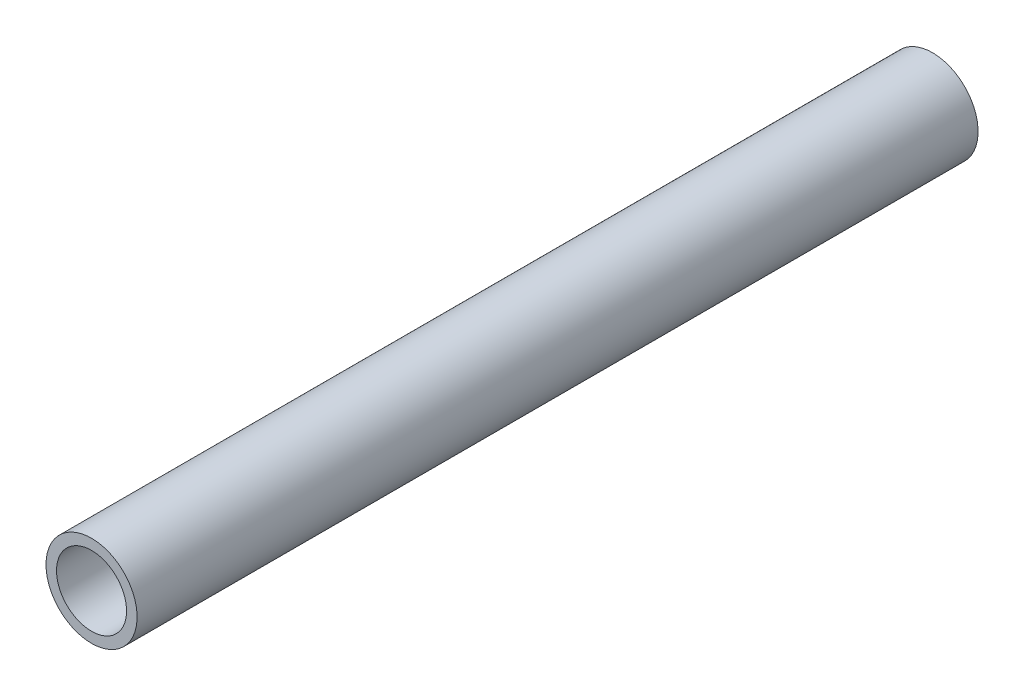
ISO-10303-21;
HEADER;
FILE_DESCRIPTION(('STEP AP214'),'2;1');
FILE_NAME('part.step','',(''),(''),'','','');
FILE_SCHEMA(('AUTOMOTIVE_DESIGN { 1 0 10303 214 1 1 1 1 }'));
ENDSEC;
DATA;
#1=APPLICATION_CONTEXT('core data for automotive mechanical design processes');
#2=APPLICATION_PROTOCOL_DEFINITION('international standard','automotive_design',2000,#1);
#3=PRODUCT_CONTEXT('',#1,'mechanical');
#4=PRODUCT('Part','Part','',(#3));
#5=PRODUCT_RELATED_PRODUCT_CATEGORY('part','',(#4));
#6=PRODUCT_DEFINITION_FORMATION('','',#4);
#7=PRODUCT_DEFINITION_CONTEXT('part definition',#1,'design');
#8=PRODUCT_DEFINITION('design','',#6,#7);
#9=PRODUCT_DEFINITION_SHAPE('','',#8);
#10=(LENGTH_UNIT() NAMED_UNIT(*) SI_UNIT(.MILLI.,.METRE.));
#11=(NAMED_UNIT(*) PLANE_ANGLE_UNIT() SI_UNIT($,.RADIAN.));
#12=(NAMED_UNIT(*) SI_UNIT($,.STERADIAN.) SOLID_ANGLE_UNIT());
#13=UNCERTAINTY_MEASURE_WITH_UNIT(LENGTH_MEASURE(1.E-05),#10,'distance_accuracy_value','');
#14=(GEOMETRIC_REPRESENTATION_CONTEXT(3) GLOBAL_UNCERTAINTY_ASSIGNED_CONTEXT((#13)) GLOBAL_UNIT_ASSIGNED_CONTEXT((#10,
#11,#12)) REPRESENTATION_CONTEXT('',''));
#15=CARTESIAN_POINT('',(0.,0.,0.));
#16=DIRECTION('',(0.,0.,1.));
#17=DIRECTION('',(1.,0.,0.));
#18=AXIS2_PLACEMENT_3D('',#15,#16,#17);
#19=CARTESIAN_POINT('',(0.,0.,304.8));
#20=DIRECTION('',(0.,0.,1.));
#21=DIRECTION('',(1.,0.,0.));
#22=AXIS2_PLACEMENT_3D('',#19,#20,#21);
#23=PLANE('',#22);
#24=CARTESIAN_POINT('',(0.,0.,304.8));
#25=DIRECTION('',(0.,0.,1.));
#26=DIRECTION('',(1.,0.,0.));
#27=AXIS2_PLACEMENT_3D('',#24,#25,#26);
#28=CIRCLE('',#27,16.51);
#29=CARTESIAN_POINT('',(-16.51,0.,304.8));
#30=VERTEX_POINT('',#29);
#31=EDGE_CURVE('E10',#30,#30,#28,.T.);
#32=ORIENTED_EDGE('',*,*,#31,.T.);
#33=EDGE_LOOP('',(#32));
#34=FACE_BOUND('',#33,.T.);
#35=CARTESIAN_POINT('',(0.,0.,304.8));
#36=DIRECTION('',(0.,0.,1.));
#37=DIRECTION('',(1.,0.,0.));
#38=AXIS2_PLACEMENT_3D('',#35,#36,#37);
#39=CIRCLE('',#38,12.7);
#40=CARTESIAN_POINT('',(-12.7,0.,304.8));
#41=VERTEX_POINT('',#40);
#42=EDGE_CURVE('E45',#41,#41,#39,.T.);
#43=ORIENTED_EDGE('',*,*,#42,.F.);
#44=EDGE_LOOP('',(#43));
#45=FACE_BOUND('',#44,.T.);
#46=ADVANCED_FACE('F34',(#34,#45),#23,.T.);
#47=CARTESIAN_POINT('',(0.,0.,0.));
#48=DIRECTION('',(0.,0.,1.));
#49=DIRECTION('',(1.,0.,0.));
#50=AXIS2_PLACEMENT_3D('',#47,#48,#49);
#51=PLANE('',#50);
#52=CARTESIAN_POINT('',(0.,0.,0.));
#53=DIRECTION('',(0.,0.,1.));
#54=DIRECTION('',(1.,0.,0.));
#55=AXIS2_PLACEMENT_3D('',#52,#53,#54);
#56=CIRCLE('',#55,16.51);
#57=CARTESIAN_POINT('',(-16.51,0.,0.));
#58=VERTEX_POINT('',#57);
#59=EDGE_CURVE('E38',#58,#58,#56,.T.);
#60=ORIENTED_EDGE('',*,*,#59,.F.);
#61=EDGE_LOOP('',(#60));
#62=FACE_BOUND('',#61,.T.);
#63=CARTESIAN_POINT('',(0.,0.,0.));
#64=DIRECTION('',(0.,0.,1.));
#65=DIRECTION('',(1.,0.,0.));
#66=AXIS2_PLACEMENT_3D('',#63,#64,#65);
#67=CIRCLE('',#66,12.7);
#68=CARTESIAN_POINT('',(-12.7,0.,0.));
#69=VERTEX_POINT('',#68);
#70=EDGE_CURVE('E47',#69,#69,#67,.T.);
#71=ORIENTED_EDGE('',*,*,#70,.T.);
#72=EDGE_LOOP('',(#71));
#73=FACE_BOUND('',#72,.T.);
#74=ADVANCED_FACE('F57',(#62,#73),#51,.F.);
#75=CARTESIAN_POINT('',(0.,0.,304.8));
#76=DIRECTION('',(0.,0.,-1.));
#77=DIRECTION('',(-1.,0.,0.));
#78=AXIS2_PLACEMENT_3D('',#75,#76,#77);
#79=CYLINDRICAL_SURFACE('',#78,16.51);
#80=CARTESIAN_POINT('',(-16.51,0.,304.8));
#81=CARTESIAN_POINT('',(-16.51,0.,301.625));
#82=CARTESIAN_POINT('',(-16.51,0.,298.45));
#83=CARTESIAN_POINT('',(-16.51,0.,292.1));
#84=CARTESIAN_POINT('',(-16.51,0.,288.925));
#85=CARTESIAN_POINT('',(-16.51,0.,282.575));
#86=CARTESIAN_POINT('',(-16.51,0.,279.4));
#87=CARTESIAN_POINT('',(-16.51,0.,273.05));
#88=CARTESIAN_POINT('',(-16.51,0.,269.875));
#89=CARTESIAN_POINT('',(-16.51,0.,263.525));
#90=CARTESIAN_POINT('',(-16.51,0.,260.35));
#91=CARTESIAN_POINT('',(-16.51,0.,254.));
#92=CARTESIAN_POINT('',(-16.51,0.,250.825));
#93=CARTESIAN_POINT('',(-16.51,0.,244.475));
#94=CARTESIAN_POINT('',(-16.51,0.,241.3));
#95=CARTESIAN_POINT('',(-16.51,0.,234.95));
#96=CARTESIAN_POINT('',(-16.51,0.,231.775));
#97=CARTESIAN_POINT('',(-16.51,0.,225.425));
#98=CARTESIAN_POINT('',(-16.51,0.,222.25));
#99=CARTESIAN_POINT('',(-16.51,0.,215.9));
#100=CARTESIAN_POINT('',(-16.51,0.,212.725));
#101=CARTESIAN_POINT('',(-16.51,0.,206.375));
#102=CARTESIAN_POINT('',(-16.51,0.,203.2));
#103=CARTESIAN_POINT('',(-16.51,0.,196.85));
#104=CARTESIAN_POINT('',(-16.51,0.,193.675));
#105=CARTESIAN_POINT('',(-16.51,0.,187.325));
#106=CARTESIAN_POINT('',(-16.51,0.,184.15));
#107=CARTESIAN_POINT('',(-16.51,0.,177.8));
#108=CARTESIAN_POINT('',(-16.51,0.,174.625));
#109=CARTESIAN_POINT('',(-16.51,0.,168.275));
#110=CARTESIAN_POINT('',(-16.51,0.,165.1));
#111=CARTESIAN_POINT('',(-16.51,0.,158.75));
#112=CARTESIAN_POINT('',(-16.51,0.,155.575));
#113=CARTESIAN_POINT('',(-16.51,0.,149.225));
#114=CARTESIAN_POINT('',(-16.51,0.,146.05));
#115=CARTESIAN_POINT('',(-16.51,0.,139.7));
#116=CARTESIAN_POINT('',(-16.51,0.,136.525));
#117=CARTESIAN_POINT('',(-16.51,0.,130.175));
#118=CARTESIAN_POINT('',(-16.51,0.,127.));
#119=CARTESIAN_POINT('',(-16.51,0.,120.65));
#120=CARTESIAN_POINT('',(-16.51,0.,117.475));
#121=CARTESIAN_POINT('',(-16.51,0.,111.125));
#122=CARTESIAN_POINT('',(-16.51,0.,107.95));
#123=CARTESIAN_POINT('',(-16.51,0.,101.6));
#124=CARTESIAN_POINT('',(-16.51,0.,98.425));
#125=CARTESIAN_POINT('',(-16.51,0.,92.075));
#126=CARTESIAN_POINT('',(-16.51,0.,88.9));
#127=CARTESIAN_POINT('',(-16.51,0.,82.55));
#128=CARTESIAN_POINT('',(-16.51,0.,79.375));
#129=CARTESIAN_POINT('',(-16.51,0.,73.025));
#130=CARTESIAN_POINT('',(-16.51,0.,69.85));
#131=CARTESIAN_POINT('',(-16.51,0.,63.5));
#132=CARTESIAN_POINT('',(-16.51,0.,60.325));
#133=CARTESIAN_POINT('',(-16.51,0.,53.975));
#134=CARTESIAN_POINT('',(-16.51,0.,50.8));
#135=CARTESIAN_POINT('',(-16.51,0.,44.45));
#136=CARTESIAN_POINT('',(-16.51,0.,41.275));
#137=CARTESIAN_POINT('',(-16.51,0.,34.925));
#138=CARTESIAN_POINT('',(-16.51,0.,31.75));
#139=CARTESIAN_POINT('',(-16.51,0.,25.4));
#140=CARTESIAN_POINT('',(-16.51,0.,22.225));
#141=CARTESIAN_POINT('',(-16.51,0.,15.875));
#142=CARTESIAN_POINT('',(-16.51,0.,12.7));
#143=CARTESIAN_POINT('',(-16.51,0.,6.35));
#144=CARTESIAN_POINT('',(-16.51,0.,3.175));
#145=CARTESIAN_POINT('',(-16.51,0.,0.));
#146=B_SPLINE_CURVE_WITH_KNOTS('',3,(#80,#81,#82,#83,#84,#85,#86,#87,#88,#89,#90,#91,#92,#93,
#94,#95,#96,#97,#98,#99,#100,#101,#102,#103,#104,#105,#106,#107,#108,#109,#110,#111,#112,#113,
#114,#115,#116,#117,#118,#119,#120,#121,#122,#123,#124,#125,#126,#127,#128,#129,#130,#131,#132,
#133,#134,#135,#136,#137,#138,#139,#140,#141,#142,#143,#144,#145),.UNSPECIFIED.,.F.,.F.,(4,2,2,
2,2,2,2,2,2,2,2,2,2,2,2,2,2,2,2,2,2,2,2,2,2,2,2,2,2,2,2,2,4),(0.,9.52499999999995,19.05,28.575,
38.1,47.625,57.15,66.675,76.2,85.725,95.2499999999999,104.775,114.3,123.825,133.35,142.875,
152.4,161.925,171.45,180.975,190.5,200.025,209.55,219.075,228.6,238.125,247.65,257.175,266.7,
276.225,285.75,295.275,304.8),.UNSPECIFIED.);
#147=EDGE_CURVE('BSEAM36',#30,#58,#146,.T.);
#148=ORIENTED_EDGE('',*,*,#31,.F.);
#149=ORIENTED_EDGE('',*,*,#59,.T.);
#150=ORIENTED_EDGE('',*,*,#147,.T.);
#151=ORIENTED_EDGE('',*,*,#147,.F.);
#152=EDGE_LOOP('',(#148,#150,#149,#151));
#153=FACE_BOUND('',#152,.T.);
#154=ADVANCED_FACE('F36',(#153),#79,.T.);
#155=CARTESIAN_POINT('',(0.,0.,304.8));
#156=DIRECTION('',(0.,0.,-1.));
#157=DIRECTION('',(-1.,0.,0.));
#158=AXIS2_PLACEMENT_3D('',#155,#156,#157);
#159=CYLINDRICAL_SURFACE('',#158,12.7);
#160=CARTESIAN_POINT('',(-12.7,0.,304.8));
#161=CARTESIAN_POINT('',(-12.7,0.,301.625));
#162=CARTESIAN_POINT('',(-12.7,0.,298.45));
#163=CARTESIAN_POINT('',(-12.7,0.,292.1));
#164=CARTESIAN_POINT('',(-12.7,0.,288.925));
#165=CARTESIAN_POINT('',(-12.7,0.,282.575));
#166=CARTESIAN_POINT('',(-12.7,0.,279.4));
#167=CARTESIAN_POINT('',(-12.7,0.,273.05));
#168=CARTESIAN_POINT('',(-12.7,0.,269.875));
#169=CARTESIAN_POINT('',(-12.7,0.,263.525));
#170=CARTESIAN_POINT('',(-12.7,0.,260.35));
#171=CARTESIAN_POINT('',(-12.7,0.,254.));
#172=CARTESIAN_POINT('',(-12.7,0.,250.825));
#173=CARTESIAN_POINT('',(-12.7,0.,244.475));
#174=CARTESIAN_POINT('',(-12.7,0.,241.3));
#175=CARTESIAN_POINT('',(-12.7,0.,234.95));
#176=CARTESIAN_POINT('',(-12.7,0.,231.775));
#177=CARTESIAN_POINT('',(-12.7,0.,225.425));
#178=CARTESIAN_POINT('',(-12.7,0.,222.25));
#179=CARTESIAN_POINT('',(-12.7,0.,215.9));
#180=CARTESIAN_POINT('',(-12.7,0.,212.725));
#181=CARTESIAN_POINT('',(-12.7,0.,206.375));
#182=CARTESIAN_POINT('',(-12.7,0.,203.2));
#183=CARTESIAN_POINT('',(-12.7,0.,196.85));
#184=CARTESIAN_POINT('',(-12.7,0.,193.675));
#185=CARTESIAN_POINT('',(-12.7,0.,187.325));
#186=CARTESIAN_POINT('',(-12.7,0.,184.15));
#187=CARTESIAN_POINT('',(-12.7,0.,177.8));
#188=CARTESIAN_POINT('',(-12.7,0.,174.625));
#189=CARTESIAN_POINT('',(-12.7,0.,168.275));
#190=CARTESIAN_POINT('',(-12.7,0.,165.1));
#191=CARTESIAN_POINT('',(-12.7,0.,158.75));
#192=CARTESIAN_POINT('',(-12.7,0.,155.575));
#193=CARTESIAN_POINT('',(-12.7,0.,149.225));
#194=CARTESIAN_POINT('',(-12.7,0.,146.05));
#195=CARTESIAN_POINT('',(-12.7,0.,139.7));
#196=CARTESIAN_POINT('',(-12.7,0.,136.525));
#197=CARTESIAN_POINT('',(-12.7,0.,130.175));
#198=CARTESIAN_POINT('',(-12.7,0.,127.));
#199=CARTESIAN_POINT('',(-12.7,0.,120.65));
#200=CARTESIAN_POINT('',(-12.7,0.,117.475));
#201=CARTESIAN_POINT('',(-12.7,0.,111.125));
#202=CARTESIAN_POINT('',(-12.7,0.,107.95));
#203=CARTESIAN_POINT('',(-12.7,0.,101.6));
#204=CARTESIAN_POINT('',(-12.7,0.,98.425));
#205=CARTESIAN_POINT('',(-12.7,0.,92.075));
#206=CARTESIAN_POINT('',(-12.7,0.,88.9));
#207=CARTESIAN_POINT('',(-12.7,0.,82.55));
#208=CARTESIAN_POINT('',(-12.7,0.,79.375));
#209=CARTESIAN_POINT('',(-12.7,0.,73.025));
#210=CARTESIAN_POINT('',(-12.7,0.,69.85));
#211=CARTESIAN_POINT('',(-12.7,0.,63.5));
#212=CARTESIAN_POINT('',(-12.7,0.,60.325));
#213=CARTESIAN_POINT('',(-12.7,0.,53.975));
#214=CARTESIAN_POINT('',(-12.7,0.,50.8));
#215=CARTESIAN_POINT('',(-12.7,0.,44.45));
#216=CARTESIAN_POINT('',(-12.7,0.,41.275));
#217=CARTESIAN_POINT('',(-12.7,0.,34.925));
#218=CARTESIAN_POINT('',(-12.7,0.,31.75));
#219=CARTESIAN_POINT('',(-12.7,0.,25.4));
#220=CARTESIAN_POINT('',(-12.7,0.,22.225));
#221=CARTESIAN_POINT('',(-12.7,0.,15.875));
#222=CARTESIAN_POINT('',(-12.7,0.,12.7));
#223=CARTESIAN_POINT('',(-12.7,0.,6.35));
#224=CARTESIAN_POINT('',(-12.7,0.,3.175));
#225=CARTESIAN_POINT('',(-12.7,0.,0.));
#226=B_SPLINE_CURVE_WITH_KNOTS('',3,(#160,#161,#162,#163,#164,#165,#166,#167,#168,#169,#170,
#171,#172,#173,#174,#175,#176,#177,#178,#179,#180,#181,#182,#183,#184,#185,#186,#187,#188,#189,
#190,#191,#192,#193,#194,#195,#196,#197,#198,#199,#200,#201,#202,#203,#204,#205,#206,#207,#208,
#209,#210,#211,#212,#213,#214,#215,#216,#217,#218,#219,#220,#221,#222,#223,#224,#225),
.UNSPECIFIED.,.F.,.F.,(4,2,2,2,2,2,2,2,2,2,2,2,2,2,2,2,2,2,2,2,2,2,2,2,2,2,2,2,2,2,2,2,4),(0.,
9.52500000000001,19.05,28.575,38.1,47.625,57.15,66.675,76.2,85.7250000000001,95.2500000000001,
104.775,114.3,123.825,133.35,142.875,152.4,161.925,171.45,180.975,190.5,200.025,209.55,219.075,
228.6,238.125,247.65,257.175,266.7,276.225,285.75,295.275,304.8),.UNSPECIFIED.);
#227=EDGE_CURVE('BSEAM53',#41,#69,#226,.T.);
#228=ORIENTED_EDGE('',*,*,#42,.T.);
#229=ORIENTED_EDGE('',*,*,#70,.F.);
#230=ORIENTED_EDGE('',*,*,#227,.T.);
#231=ORIENTED_EDGE('',*,*,#227,.F.);
#232=EDGE_LOOP('',(#228,#230,#229,#231));
#233=FACE_BOUND('',#232,.T.);
#234=ADVANCED_FACE('F53',(#233),#159,.F.);
#235=CLOSED_SHELL('',(#46,#74,#154,#234));
#236=MANIFOLD_SOLID_BREP('B2',#235);
#237=ADVANCED_BREP_SHAPE_REPRESENTATION('',(#18,#236),#14);
#238=SHAPE_DEFINITION_REPRESENTATION(#9,#237);
ENDSEC;
END-ISO-10303-21;
